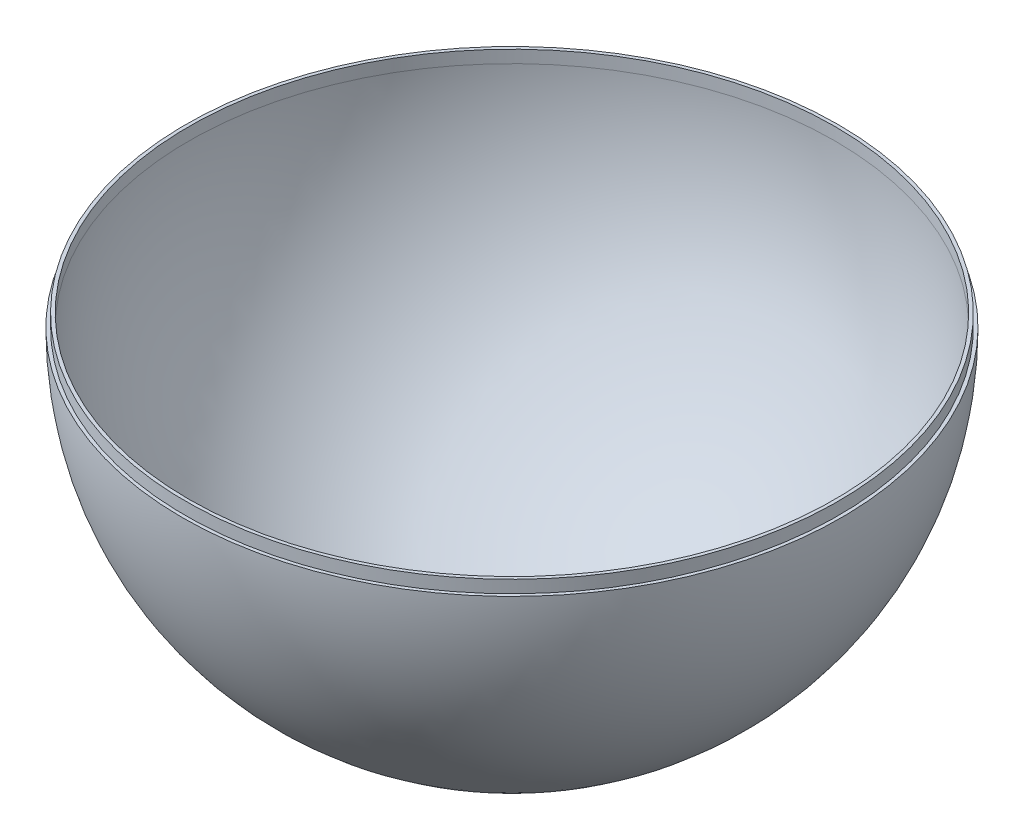
ISO-10303-21;
HEADER;
FILE_DESCRIPTION(('STEP AP214'),'2;1');
FILE_NAME('part.step','',(''),(''),'','','');
FILE_SCHEMA(('AUTOMOTIVE_DESIGN { 1 0 10303 214 1 1 1 1 }'));
ENDSEC;
DATA;
#1=APPLICATION_CONTEXT('core data for automotive mechanical design processes');
#2=APPLICATION_PROTOCOL_DEFINITION('international standard','automotive_design',2000,#1);
#3=PRODUCT_CONTEXT('',#1,'mechanical');
#4=PRODUCT('Part','Part','',(#3));
#5=PRODUCT_RELATED_PRODUCT_CATEGORY('part','',(#4));
#6=PRODUCT_DEFINITION_FORMATION('','',#4);
#7=PRODUCT_DEFINITION_CONTEXT('part definition',#1,'design');
#8=PRODUCT_DEFINITION('design','',#6,#7);
#9=PRODUCT_DEFINITION_SHAPE('','',#8);
#10=(LENGTH_UNIT() NAMED_UNIT(*) SI_UNIT(.MILLI.,.METRE.));
#11=(NAMED_UNIT(*) PLANE_ANGLE_UNIT() SI_UNIT($,.RADIAN.));
#12=(NAMED_UNIT(*) SI_UNIT($,.STERADIAN.) SOLID_ANGLE_UNIT());
#13=UNCERTAINTY_MEASURE_WITH_UNIT(LENGTH_MEASURE(1.E-05),#10,'distance_accuracy_value','');
#14=(GEOMETRIC_REPRESENTATION_CONTEXT(3) GLOBAL_UNCERTAINTY_ASSIGNED_CONTEXT((#13)) GLOBAL_UNIT_ASSIGNED_CONTEXT((#10,
#11,#12)) REPRESENTATION_CONTEXT('',''));
#15=CARTESIAN_POINT('',(0.,0.,0.));
#16=DIRECTION('',(0.,0.,1.));
#17=DIRECTION('',(1.,0.,0.));
#18=AXIS2_PLACEMENT_3D('',#15,#16,#17);
#19=CARTESIAN_POINT('',(0.,0.,0.));
#20=DIRECTION('',(0.,1.,0.));
#21=DIRECTION('',(0.,0.,1.));
#22=AXIS2_PLACEMENT_3D('',#19,#20,#21);
#23=PLANE('',#22);
#24=CARTESIAN_POINT('',(0.,0.,0.));
#25=DIRECTION('',(0.,1.,0.));
#26=DIRECTION('',(0.,0.,1.));
#27=AXIS2_PLACEMENT_3D('',#24,#25,#26);
#28=CIRCLE('',#27,100.);
#29=CARTESIAN_POINT('',(0.,0.,100.));
#30=VERTEX_POINT('',#29);
#31=EDGE_CURVE('E10',#30,#30,#28,.T.);
#32=ORIENTED_EDGE('',*,*,#31,.T.);
#33=EDGE_LOOP('',(#32));
#34=FACE_BOUND('',#33,.T.);
#35=CARTESIAN_POINT('',(0.,0.,0.));
#36=DIRECTION('',(0.,1.,0.));
#37=DIRECTION('',(0.,0.,1.));
#38=AXIS2_PLACEMENT_3D('',#35,#36,#37);
#39=CIRCLE('',#38,99.);
#40=CARTESIAN_POINT('',(0.,0.,-99.));
#41=VERTEX_POINT('',#40);
#42=EDGE_CURVE('E52',#41,#41,#39,.T.);
#43=ORIENTED_EDGE('',*,*,#42,.F.);
#44=EDGE_LOOP('',(#43));
#45=FACE_BOUND('',#44,.T.);
#46=ADVANCED_FACE('F41',(#34,#45),#23,.T.);
#47=CARTESIAN_POINT('',(0.,0.,0.));
#48=DIRECTION('',(0.,0.,-1.));
#49=DIRECTION('',(1.,0.,0.));
#50=AXIS2_PLACEMENT_3D('',#47,#48,#49);
#51=SPHERICAL_SURFACE('',#50,100.);
#52=CARTESIAN_POINT('',(0.,0.,0.));
#53=DIRECTION('',(0.,1.,0.));
#54=DIRECTION('',(0.,0.,1.));
#55=AXIS2_PLACEMENT_3D('',#52,#53,#54);
#56=SPHERICAL_SURFACE('',#55,100.);
#57=ORIENTED_EDGE('',*,*,#31,.F.);
#58=EDGE_LOOP('',(#57));
#59=FACE_BOUND('',#58,.T.);
#60=ADVANCED_FACE('F71',(#59),#56,.T.);
#61=CARTESIAN_POINT('',(0.,3.8,0.));
#62=DIRECTION('',(0.,1.,0.));
#63=DIRECTION('',(0.,0.,1.));
#64=AXIS2_PLACEMENT_3D('',#61,#62,#63);
#65=PLANE('',#64);
#66=CARTESIAN_POINT('',(0.,3.8,0.));
#67=DIRECTION('',(0.,1.,0.));
#68=DIRECTION('',(0.,0.,1.));
#69=AXIS2_PLACEMENT_3D('',#66,#67,#68);
#70=CIRCLE('',#69,99.);
#71=CARTESIAN_POINT('',(0.,3.80000000000001,-99.));
#72=VERTEX_POINT('',#71);
#73=EDGE_CURVE('E48',#72,#72,#70,.T.);
#74=ORIENTED_EDGE('',*,*,#73,.T.);
#75=EDGE_LOOP('',(#74));
#76=FACE_BOUND('',#75,.T.);
#77=CARTESIAN_POINT('',(0.,3.8,0.));
#78=DIRECTION('',(0.,1.,0.));
#79=DIRECTION('',(0.,0.,1.));
#80=AXIS2_PLACEMENT_3D('',#77,#78,#79);
#81=CIRCLE('',#80,98.);
#82=CARTESIAN_POINT('',(0.,3.80000000000001,-98.));
#83=VERTEX_POINT('',#82);
#84=EDGE_CURVE('E57',#83,#83,#81,.T.);
#85=ORIENTED_EDGE('',*,*,#84,.F.);
#86=EDGE_LOOP('',(#85));
#87=FACE_BOUND('',#86,.T.);
#88=ADVANCED_FACE('F68',(#76,#87),#65,.T.);
#89=CARTESIAN_POINT('',(0.,3.8,0.));
#90=DIRECTION('',(0.,-1.,0.));
#91=DIRECTION('',(0.,0.,-1.));
#92=AXIS2_PLACEMENT_3D('',#89,#90,#91);
#93=CYLINDRICAL_SURFACE('',#92,99.);
#94=CARTESIAN_POINT('',(0.,3.80000000000001,-99.));
#95=CARTESIAN_POINT('',(0.,3.76041666666667,-99.));
#96=CARTESIAN_POINT('',(0.,3.72083333333334,-99.));
#97=CARTESIAN_POINT('',(0.,3.64166666666667,-99.));
#98=CARTESIAN_POINT('',(0.,3.60208333333334,-99.));
#99=CARTESIAN_POINT('',(0.,3.52291666666667,-99.));
#100=CARTESIAN_POINT('',(0.,3.48333333333334,-99.));
#101=CARTESIAN_POINT('',(0.,3.40416666666667,-99.));
#102=CARTESIAN_POINT('',(0.,3.36458333333334,-99.));
#103=CARTESIAN_POINT('',(0.,3.28541666666667,-99.));
#104=CARTESIAN_POINT('',(0.,3.24583333333334,-99.));
#105=CARTESIAN_POINT('',(0.,3.16666666666667,-99.));
#106=CARTESIAN_POINT('',(0.,3.12708333333334,-99.));
#107=CARTESIAN_POINT('',(0.,3.04791666666667,-99.));
#108=CARTESIAN_POINT('',(0.,3.00833333333334,-99.));
#109=CARTESIAN_POINT('',(0.,2.92916666666667,-99.));
#110=CARTESIAN_POINT('',(0.,2.88958333333334,-99.));
#111=CARTESIAN_POINT('',(0.,2.81041666666667,-99.));
#112=CARTESIAN_POINT('',(0.,2.77083333333334,-99.));
#113=CARTESIAN_POINT('',(0.,2.69166666666667,-99.));
#114=CARTESIAN_POINT('',(0.,2.65208333333334,-99.));
#115=CARTESIAN_POINT('',(0.,2.57291666666667,-99.));
#116=CARTESIAN_POINT('',(0.,2.53333333333334,-99.));
#117=CARTESIAN_POINT('',(0.,2.45416666666667,-99.));
#118=CARTESIAN_POINT('',(0.,2.41458333333334,-99.));
#119=CARTESIAN_POINT('',(0.,2.33541666666667,-99.));
#120=CARTESIAN_POINT('',(0.,2.29583333333334,-99.));
#121=CARTESIAN_POINT('',(0.,2.21666666666667,-99.));
#122=CARTESIAN_POINT('',(0.,2.17708333333334,-99.));
#123=CARTESIAN_POINT('',(0.,2.09791666666667,-99.));
#124=CARTESIAN_POINT('',(0.,2.05833333333334,-99.));
#125=CARTESIAN_POINT('',(0.,1.97916666666667,-99.));
#126=CARTESIAN_POINT('',(0.,1.93958333333334,-99.));
#127=CARTESIAN_POINT('',(0.,1.86041666666667,-99.));
#128=CARTESIAN_POINT('',(0.,1.82083333333334,-99.));
#129=CARTESIAN_POINT('',(0.,1.74166666666667,-99.));
#130=CARTESIAN_POINT('',(0.,1.70208333333334,-99.));
#131=CARTESIAN_POINT('',(0.,1.62291666666667,-99.));
#132=CARTESIAN_POINT('',(0.,1.58333333333334,-99.));
#133=CARTESIAN_POINT('',(0.,1.50416666666667,-99.));
#134=CARTESIAN_POINT('',(0.,1.46458333333334,-99.));
#135=CARTESIAN_POINT('',(0.,1.38541666666667,-99.));
#136=CARTESIAN_POINT('',(0.,1.34583333333334,-99.));
#137=CARTESIAN_POINT('',(0.,1.26666666666667,-99.));
#138=CARTESIAN_POINT('',(0.,1.22708333333334,-99.));
#139=CARTESIAN_POINT('',(0.,1.14791666666667,-99.));
#140=CARTESIAN_POINT('',(0.,1.10833333333334,-99.));
#141=CARTESIAN_POINT('',(0.,1.02916666666667,-99.));
#142=CARTESIAN_POINT('',(0.,0.989583333333339,-99.));
#143=CARTESIAN_POINT('',(0.,0.910416666666673,-99.));
#144=CARTESIAN_POINT('',(0.,0.870833333333339,-99.));
#145=CARTESIAN_POINT('',(0.,0.791666666666673,-99.));
#146=CARTESIAN_POINT('',(0.,0.752083333333339,-99.));
#147=CARTESIAN_POINT('',(0.,0.672916666666673,-99.));
#148=CARTESIAN_POINT('',(0.,0.63333333333334,-99.));
#149=CARTESIAN_POINT('',(0.,0.554166666666673,-99.));
#150=CARTESIAN_POINT('',(0.,0.514583333333339,-99.));
#151=CARTESIAN_POINT('',(0.,0.435416666666673,-99.));
#152=CARTESIAN_POINT('',(0.,0.395833333333339,-99.));
#153=CARTESIAN_POINT('',(0.,0.316666666666673,-99.));
#154=CARTESIAN_POINT('',(0.,0.277083333333339,-99.));
#155=CARTESIAN_POINT('',(0.,0.197916666666673,-99.));
#156=CARTESIAN_POINT('',(0.,0.158333333333339,-99.));
#157=CARTESIAN_POINT('',(0.,0.0791666666666727,-99.));
#158=CARTESIAN_POINT('',(0.,0.0395833333333393,-99.));
#159=CARTESIAN_POINT('',(0.,0.,-99.));
#160=B_SPLINE_CURVE_WITH_KNOTS('',3,(#94,#95,#96,#97,#98,#99,#100,#101,#102,#103,#104,#105,#106,
#107,#108,#109,#110,#111,#112,#113,#114,#115,#116,#117,#118,#119,#120,#121,#122,#123,#124,#125,
#126,#127,#128,#129,#130,#131,#132,#133,#134,#135,#136,#137,#138,#139,#140,#141,#142,#143,#144,
#145,#146,#147,#148,#149,#150,#151,#152,#153,#154,#155,#156,#157,#158,#159),.UNSPECIFIED.,.F.,
.F.,(4,2,2,2,2,2,2,2,2,2,2,2,2,2,2,2,2,2,2,2,2,2,2,2,2,2,2,2,2,2,2,2,4),(0.,0.11875,0.2375,
0.35625,0.475,0.59375,0.7125,0.831249999999999,0.95,1.06875,1.1875,1.30625,1.425,1.54375,1.6625,
1.78125,1.9,2.01875,2.1375,2.25625,2.375,2.49375,2.6125,2.73125,2.85,2.96875,3.0875,3.20625,
3.325,3.44375,3.5625,3.68125,3.8),.UNSPECIFIED.);
#161=EDGE_CURVE('BSEAM70',#72,#41,#160,.T.);
#162=ORIENTED_EDGE('',*,*,#73,.F.);
#163=ORIENTED_EDGE('',*,*,#42,.T.);
#164=ORIENTED_EDGE('',*,*,#161,.T.);
#165=ORIENTED_EDGE('',*,*,#161,.F.);
#166=EDGE_LOOP('',(#162,#164,#163,#165));
#167=FACE_BOUND('',#166,.T.);
#168=ADVANCED_FACE('F70',(#167),#93,.T.);
#169=CARTESIAN_POINT('',(0.,3.8,0.));
#170=DIRECTION('',(0.,-1.,0.));
#171=DIRECTION('',(0.,0.,-1.));
#172=AXIS2_PLACEMENT_3D('',#169,#170,#171);
#173=CYLINDRICAL_SURFACE('',#172,98.);
#174=CARTESIAN_POINT('',(0.,0.,0.));
#175=DIRECTION('',(0.,1.,0.));
#176=DIRECTION('',(0.,0.,1.));
#177=AXIS2_PLACEMENT_3D('',#174,#175,#176);
#178=CIRCLE('',#177,98.);
#179=CARTESIAN_POINT('',(0.,0.,-98.));
#180=VERTEX_POINT('',#179);
#181=EDGE_CURVE('E59',#180,#180,#178,.T.);
#182=CARTESIAN_POINT('',(0.,3.80000000000001,-98.));
#183=CARTESIAN_POINT('',(0.,3.76041666666667,-98.));
#184=CARTESIAN_POINT('',(0.,3.72083333333334,-98.));
#185=CARTESIAN_POINT('',(0.,3.64166666666667,-98.));
#186=CARTESIAN_POINT('',(0.,3.60208333333334,-98.));
#187=CARTESIAN_POINT('',(0.,3.52291666666667,-98.));
#188=CARTESIAN_POINT('',(0.,3.48333333333334,-98.));
#189=CARTESIAN_POINT('',(0.,3.40416666666667,-98.));
#190=CARTESIAN_POINT('',(0.,3.36458333333334,-98.));
#191=CARTESIAN_POINT('',(0.,3.28541666666667,-98.));
#192=CARTESIAN_POINT('',(0.,3.24583333333334,-98.));
#193=CARTESIAN_POINT('',(0.,3.16666666666667,-98.));
#194=CARTESIAN_POINT('',(0.,3.12708333333334,-98.));
#195=CARTESIAN_POINT('',(0.,3.04791666666667,-98.));
#196=CARTESIAN_POINT('',(0.,3.00833333333334,-98.));
#197=CARTESIAN_POINT('',(0.,2.92916666666667,-98.));
#198=CARTESIAN_POINT('',(0.,2.88958333333334,-98.));
#199=CARTESIAN_POINT('',(0.,2.81041666666667,-98.));
#200=CARTESIAN_POINT('',(0.,2.77083333333334,-98.));
#201=CARTESIAN_POINT('',(0.,2.69166666666667,-98.));
#202=CARTESIAN_POINT('',(0.,2.65208333333334,-98.));
#203=CARTESIAN_POINT('',(0.,2.57291666666667,-98.));
#204=CARTESIAN_POINT('',(0.,2.53333333333334,-98.));
#205=CARTESIAN_POINT('',(0.,2.45416666666667,-98.));
#206=CARTESIAN_POINT('',(0.,2.41458333333334,-98.));
#207=CARTESIAN_POINT('',(0.,2.33541666666667,-98.));
#208=CARTESIAN_POINT('',(0.,2.29583333333334,-98.));
#209=CARTESIAN_POINT('',(0.,2.21666666666667,-98.));
#210=CARTESIAN_POINT('',(0.,2.17708333333334,-98.));
#211=CARTESIAN_POINT('',(0.,2.09791666666667,-98.));
#212=CARTESIAN_POINT('',(0.,2.05833333333334,-98.));
#213=CARTESIAN_POINT('',(0.,1.97916666666667,-98.));
#214=CARTESIAN_POINT('',(0.,1.93958333333334,-98.));
#215=CARTESIAN_POINT('',(0.,1.86041666666667,-98.));
#216=CARTESIAN_POINT('',(0.,1.82083333333334,-98.));
#217=CARTESIAN_POINT('',(0.,1.74166666666667,-98.));
#218=CARTESIAN_POINT('',(0.,1.70208333333334,-98.));
#219=CARTESIAN_POINT('',(0.,1.62291666666667,-98.));
#220=CARTESIAN_POINT('',(0.,1.58333333333334,-98.));
#221=CARTESIAN_POINT('',(0.,1.50416666666667,-98.));
#222=CARTESIAN_POINT('',(0.,1.46458333333334,-98.));
#223=CARTESIAN_POINT('',(0.,1.38541666666667,-98.));
#224=CARTESIAN_POINT('',(0.,1.34583333333334,-98.));
#225=CARTESIAN_POINT('',(0.,1.26666666666667,-98.));
#226=CARTESIAN_POINT('',(0.,1.22708333333334,-98.));
#227=CARTESIAN_POINT('',(0.,1.14791666666667,-98.));
#228=CARTESIAN_POINT('',(0.,1.10833333333334,-98.));
#229=CARTESIAN_POINT('',(0.,1.02916666666667,-98.));
#230=CARTESIAN_POINT('',(0.,0.98958333333334,-98.));
#231=CARTESIAN_POINT('',(0.,0.910416666666673,-98.));
#232=CARTESIAN_POINT('',(0.,0.870833333333339,-98.));
#233=CARTESIAN_POINT('',(0.,0.791666666666673,-98.));
#234=CARTESIAN_POINT('',(0.,0.752083333333339,-98.));
#235=CARTESIAN_POINT('',(0.,0.672916666666673,-98.));
#236=CARTESIAN_POINT('',(0.,0.63333333333334,-98.));
#237=CARTESIAN_POINT('',(0.,0.554166666666673,-98.));
#238=CARTESIAN_POINT('',(0.,0.514583333333339,-98.));
#239=CARTESIAN_POINT('',(0.,0.435416666666673,-98.));
#240=CARTESIAN_POINT('',(0.,0.39583333333334,-98.));
#241=CARTESIAN_POINT('',(0.,0.316666666666673,-98.));
#242=CARTESIAN_POINT('',(0.,0.277083333333339,-98.));
#243=CARTESIAN_POINT('',(0.,0.197916666666673,-98.));
#244=CARTESIAN_POINT('',(0.,0.158333333333339,-98.));
#245=CARTESIAN_POINT('',(0.,0.0791666666666727,-98.));
#246=CARTESIAN_POINT('',(0.,0.0395833333333394,-98.));
#247=CARTESIAN_POINT('',(0.,0.,-98.));
#248=B_SPLINE_CURVE_WITH_KNOTS('',3,(#182,#183,#184,#185,#186,#187,#188,#189,#190,#191,#192,
#193,#194,#195,#196,#197,#198,#199,#200,#201,#202,#203,#204,#205,#206,#207,#208,#209,#210,#211,
#212,#213,#214,#215,#216,#217,#218,#219,#220,#221,#222,#223,#224,#225,#226,#227,#228,#229,#230,
#231,#232,#233,#234,#235,#236,#237,#238,#239,#240,#241,#242,#243,#244,#245,#246,#247),
.UNSPECIFIED.,.F.,.F.,(4,2,2,2,2,2,2,2,2,2,2,2,2,2,2,2,2,2,2,2,2,2,2,2,2,2,2,2,2,2,2,2,4),(0.,
0.11875,0.2375,0.35625,0.475,0.59375,0.7125,0.83125,0.95,1.06875,1.1875,1.30625,1.425,1.54375,
1.6625,1.78125,1.9,2.01875,2.1375,2.25625,2.375,2.49375,2.6125,2.73125,2.85,2.96875,3.0875,
3.20625,3.325,3.44375,3.5625,3.68125,3.8),.UNSPECIFIED.);
#249=EDGE_CURVE('BSEAM65',#83,#180,#248,.T.);
#250=ORIENTED_EDGE('',*,*,#84,.T.);
#251=ORIENTED_EDGE('',*,*,#181,.F.);
#252=ORIENTED_EDGE('',*,*,#249,.T.);
#253=ORIENTED_EDGE('',*,*,#249,.F.);
#254=EDGE_LOOP('',(#250,#252,#251,#253));
#255=FACE_BOUND('',#254,.T.);
#256=ADVANCED_FACE('F65',(#255),#173,.F.);
#257=CARTESIAN_POINT('',(0.,0.,0.));
#258=DIRECTION('',(0.,0.,-1.));
#259=DIRECTION('',(1.,0.,0.));
#260=AXIS2_PLACEMENT_3D('',#257,#258,#259);
#261=SPHERICAL_SURFACE('',#260,98.);
#262=CARTESIAN_POINT('',(0.,0.,0.));
#263=DIRECTION('',(0.,1.,0.));
#264=DIRECTION('',(0.,0.,1.));
#265=AXIS2_PLACEMENT_3D('',#262,#263,#264);
#266=SPHERICAL_SURFACE('',#265,98.);
#267=ORIENTED_EDGE('',*,*,#181,.T.);
#268=EDGE_LOOP('',(#267));
#269=FACE_BOUND('',#268,.T.);
#270=ADVANCED_FACE('F43',(#269),#266,.F.);
#271=CLOSED_SHELL('',(#46,#60,#88,#168,#256,#270));
#272=MANIFOLD_SOLID_BREP('B2',#271);
#273=ADVANCED_BREP_SHAPE_REPRESENTATION('',(#18,#272),#14);
#274=SHAPE_DEFINITION_REPRESENTATION(#9,#273);
ENDSEC;
END-ISO-10303-21;
